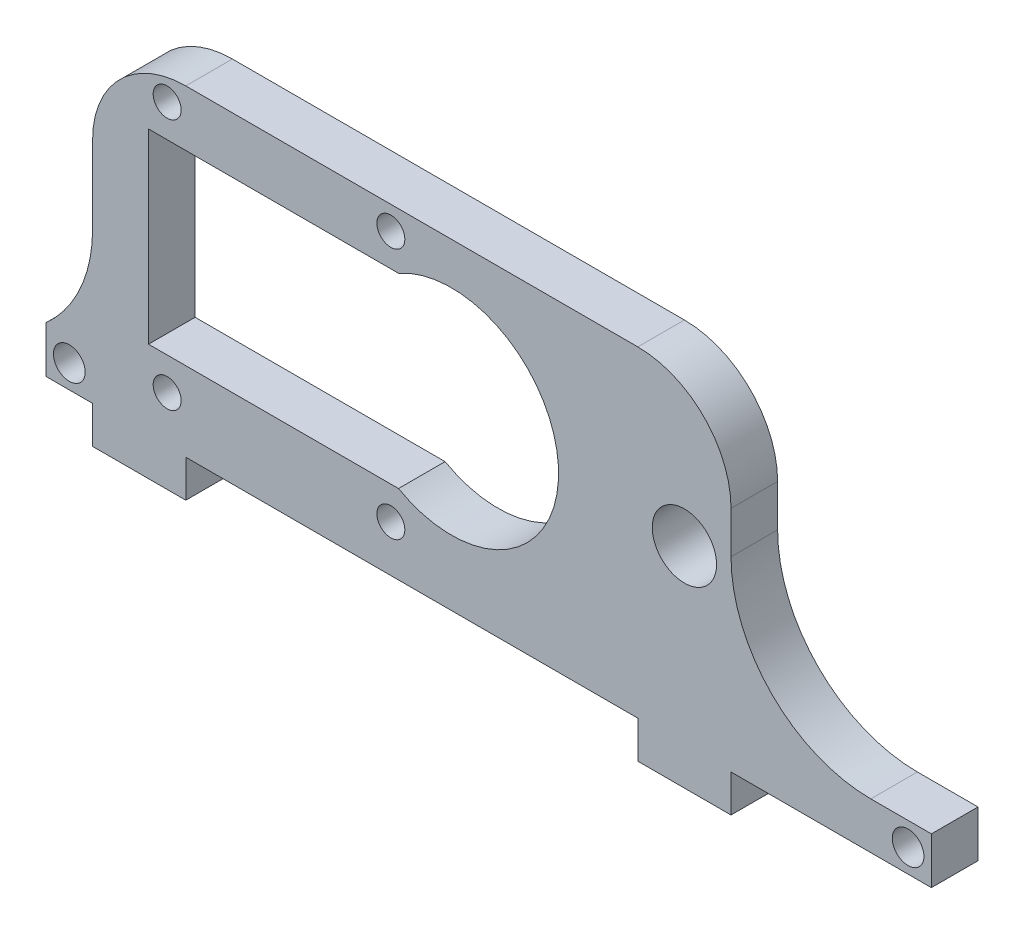
ISO-10303-21;
HEADER;
FILE_DESCRIPTION(('STEP AP214'),'2;1');
FILE_NAME('part.step','',(''),(''),'','','');
FILE_SCHEMA(('AUTOMOTIVE_DESIGN { 1 0 10303 214 1 1 1 1 }'));
ENDSEC;
DATA;
#1=APPLICATION_CONTEXT('core data for automotive mechanical design processes');
#2=APPLICATION_PROTOCOL_DEFINITION('international standard','automotive_design',2000,#1);
#3=PRODUCT_CONTEXT('',#1,'mechanical');
#4=PRODUCT('Part','Part','',(#3));
#5=PRODUCT_RELATED_PRODUCT_CATEGORY('part','',(#4));
#6=PRODUCT_DEFINITION_FORMATION('','',#4);
#7=PRODUCT_DEFINITION_CONTEXT('part definition',#1,'design');
#8=PRODUCT_DEFINITION('design','',#6,#7);
#9=PRODUCT_DEFINITION_SHAPE('','',#8);
#10=(LENGTH_UNIT() NAMED_UNIT(*) SI_UNIT(.MILLI.,.METRE.));
#11=(NAMED_UNIT(*) PLANE_ANGLE_UNIT() SI_UNIT($,.RADIAN.));
#12=(NAMED_UNIT(*) SI_UNIT($,.STERADIAN.) SOLID_ANGLE_UNIT());
#13=UNCERTAINTY_MEASURE_WITH_UNIT(LENGTH_MEASURE(1.E-05),#10,'distance_accuracy_value','');
#14=(GEOMETRIC_REPRESENTATION_CONTEXT(3) GLOBAL_UNCERTAINTY_ASSIGNED_CONTEXT((#13)) GLOBAL_UNIT_ASSIGNED_CONTEXT((#10,
#11,#12)) REPRESENTATION_CONTEXT('',''));
#15=CARTESIAN_POINT('',(0.,0.,0.));
#16=DIRECTION('',(0.,0.,1.));
#17=DIRECTION('',(1.,0.,0.));
#18=AXIS2_PLACEMENT_3D('',#15,#16,#17);
#19=CARTESIAN_POINT('',(51.5,-18.5,-5.));
#20=DIRECTION('',(1.,0.,0.));
#21=DIRECTION('',(0.,0.,-1.));
#22=AXIS2_PLACEMENT_3D('',#19,#20,#21);
#23=PLANE('',#22);
#24=DIRECTION('',(0.,1.,0.));
#25=VECTOR('',#24,1.);
#26=CARTESIAN_POINT('',(51.5,-18.5,0.));
#27=LINE('',#26,#25);
#28=CARTESIAN_POINT('',(51.5,-18.5,0.));
#29=VERTEX_POINT('',#28);
#30=CARTESIAN_POINT('',(51.5,-13.5,0.));
#31=VERTEX_POINT('',#30);
#32=EDGE_CURVE('E265',#29,#31,#27,.T.);
#33=ORIENTED_EDGE('',*,*,#32,.F.);
#34=DIRECTION('',(0.,0.,1.));
#35=VECTOR('',#34,1.);
#36=CARTESIAN_POINT('',(51.5,-18.5,-5.));
#37=LINE('',#36,#35);
#38=CARTESIAN_POINT('',(51.5,-18.5,-5.));
#39=VERTEX_POINT('',#38);
#40=EDGE_CURVE('E367',#39,#29,#37,.T.);
#41=ORIENTED_EDGE('',*,*,#40,.F.);
#42=DIRECTION('',(0.,1.,0.));
#43=VECTOR('',#42,1.);
#44=CARTESIAN_POINT('',(51.5,-18.5,-5.));
#45=LINE('',#44,#43);
#46=CARTESIAN_POINT('',(51.5,-13.5,-5.));
#47=VERTEX_POINT('',#46);
#48=EDGE_CURVE('E268',#39,#47,#45,.T.);
#49=ORIENTED_EDGE('',*,*,#48,.T.);
#50=DIRECTION('',(0.,0.,1.));
#51=VECTOR('',#50,1.);
#52=CARTESIAN_POINT('',(51.5,-13.5,-5.));
#53=LINE('',#52,#51);
#54=EDGE_CURVE('E318',#47,#31,#53,.T.);
#55=ORIENTED_EDGE('',*,*,#54,.T.);
#56=EDGE_LOOP('',(#33,#41,#49,#55));
#57=FACE_BOUND('',#56,.T.);
#58=ADVANCED_FACE('F35',(#57),#23,.T.);
#59=CARTESIAN_POINT('',(51.5,-18.5,-5.));
#60=DIRECTION('',(0.,-1.,0.));
#61=DIRECTION('',(0.,0.,-1.));
#62=AXIS2_PLACEMENT_3D('',#59,#60,#61);
#63=PLANE('',#62);
#64=DIRECTION('',(1.,0.,0.));
#65=VECTOR('',#64,1.);
#66=CARTESIAN_POINT('',(51.5,-18.5,0.));
#67=LINE('',#66,#65);
#68=CARTESIAN_POINT('',(30.,-18.5,0.));
#69=VERTEX_POINT('',#68);
#70=EDGE_CURVE('E272',#69,#29,#67,.T.);
#71=ORIENTED_EDGE('',*,*,#70,.F.);
#72=DIRECTION('',(0.,0.,1.));
#73=VECTOR('',#72,1.);
#74=CARTESIAN_POINT('',(30.,-18.5,-5.));
#75=LINE('',#74,#73);
#76=CARTESIAN_POINT('',(30.,-18.5,-5.));
#77=VERTEX_POINT('',#76);
#78=EDGE_CURVE('E370',#77,#69,#75,.T.);
#79=ORIENTED_EDGE('',*,*,#78,.F.);
#80=DIRECTION('',(1.,0.,0.));
#81=VECTOR('',#80,1.);
#82=CARTESIAN_POINT('',(51.5,-18.5,-5.));
#83=LINE('',#82,#81);
#84=EDGE_CURVE('E315',#77,#39,#83,.T.);
#85=ORIENTED_EDGE('',*,*,#84,.T.);
#86=ORIENTED_EDGE('',*,*,#40,.T.);
#87=EDGE_LOOP('',(#71,#79,#85,#86));
#88=FACE_BOUND('',#87,.T.);
#89=ADVANCED_FACE('F451',(#88),#63,.T.);
#90=CARTESIAN_POINT('',(30.,-18.5,-5.));
#91=DIRECTION('',(1.,0.,0.));
#92=DIRECTION('',(0.,0.,-1.));
#93=AXIS2_PLACEMENT_3D('',#90,#91,#92);
#94=PLANE('',#93);
#95=DIRECTION('',(0.,1.,0.));
#96=VECTOR('',#95,1.);
#97=CARTESIAN_POINT('',(30.,-18.5,0.));
#98=LINE('',#97,#96);
#99=CARTESIAN_POINT('',(30.,-22.5,0.));
#100=VERTEX_POINT('',#99);
#101=EDGE_CURVE('E362',#100,#69,#98,.T.);
#102=ORIENTED_EDGE('',*,*,#101,.F.);
#103=DIRECTION('',(0.,0.,1.));
#104=VECTOR('',#103,1.);
#105=CARTESIAN_POINT('',(30.,-22.5,-5.));
#106=LINE('',#105,#104);
#107=CARTESIAN_POINT('',(30.,-22.5,-5.));
#108=VERTEX_POINT('',#107);
#109=EDGE_CURVE('E372',#108,#100,#106,.T.);
#110=ORIENTED_EDGE('',*,*,#109,.F.);
#111=DIRECTION('',(0.,1.,0.));
#112=VECTOR('',#111,1.);
#113=CARTESIAN_POINT('',(30.,-18.5,-5.));
#114=LINE('',#113,#112);
#115=EDGE_CURVE('E312',#108,#77,#114,.T.);
#116=ORIENTED_EDGE('',*,*,#115,.T.);
#117=ORIENTED_EDGE('',*,*,#78,.T.);
#118=EDGE_LOOP('',(#102,#110,#116,#117));
#119=FACE_BOUND('',#118,.T.);
#120=ADVANCED_FACE('F454',(#119),#94,.T.);
#121=CARTESIAN_POINT('',(30.,-22.5,-5.));
#122=DIRECTION('',(0.,-1.,0.));
#123=DIRECTION('',(1.,0.,0.));
#124=AXIS2_PLACEMENT_3D('',#121,#122,#123);
#125=PLANE('',#124);
#126=DIRECTION('',(1.,0.,0.));
#127=VECTOR('',#126,1.);
#128=CARTESIAN_POINT('',(30.,-22.5,0.));
#129=LINE('',#128,#127);
#130=CARTESIAN_POINT('',(20.,-22.5,0.));
#131=VERTEX_POINT('',#130);
#132=EDGE_CURVE('E359',#131,#100,#129,.T.);
#133=ORIENTED_EDGE('',*,*,#132,.F.);
#134=DIRECTION('',(0.,0.,1.));
#135=VECTOR('',#134,1.);
#136=CARTESIAN_POINT('',(20.,-22.5,-5.));
#137=LINE('',#136,#135);
#138=CARTESIAN_POINT('',(20.,-22.5,-5.));
#139=VERTEX_POINT('',#138);
#140=EDGE_CURVE('E374',#139,#131,#137,.T.);
#141=ORIENTED_EDGE('',*,*,#140,.F.);
#142=DIRECTION('',(1.,0.,0.));
#143=VECTOR('',#142,1.);
#144=CARTESIAN_POINT('',(30.,-22.5,-5.));
#145=LINE('',#144,#143);
#146=EDGE_CURVE('E309',#139,#108,#145,.T.);
#147=ORIENTED_EDGE('',*,*,#146,.T.);
#148=ORIENTED_EDGE('',*,*,#109,.T.);
#149=EDGE_LOOP('',(#133,#141,#147,#148));
#150=FACE_BOUND('',#149,.T.);
#151=ADVANCED_FACE('F459',(#150),#125,.T.);
#152=CARTESIAN_POINT('',(20.,-18.5,-5.));
#153=DIRECTION('',(-1.,0.,0.));
#154=DIRECTION('',(0.,0.,1.));
#155=AXIS2_PLACEMENT_3D('',#152,#153,#154);
#156=PLANE('',#155);
#157=DIRECTION('',(0.,-1.,0.));
#158=VECTOR('',#157,1.);
#159=CARTESIAN_POINT('',(20.,-18.5,0.));
#160=LINE('',#159,#158);
#161=CARTESIAN_POINT('',(20.,-18.5,0.));
#162=VERTEX_POINT('',#161);
#163=EDGE_CURVE('E356',#162,#131,#160,.T.);
#164=ORIENTED_EDGE('',*,*,#163,.F.);
#165=DIRECTION('',(0.,0.,1.));
#166=VECTOR('',#165,1.);
#167=CARTESIAN_POINT('',(20.,-18.5,-5.));
#168=LINE('',#167,#166);
#169=CARTESIAN_POINT('',(20.,-18.5,-5.));
#170=VERTEX_POINT('',#169);
#171=EDGE_CURVE('E376',#170,#162,#168,.T.);
#172=ORIENTED_EDGE('',*,*,#171,.F.);
#173=DIRECTION('',(0.,-1.,0.));
#174=VECTOR('',#173,1.);
#175=CARTESIAN_POINT('',(20.,-18.5,-5.));
#176=LINE('',#175,#174);
#177=EDGE_CURVE('E306',#170,#139,#176,.T.);
#178=ORIENTED_EDGE('',*,*,#177,.T.);
#179=ORIENTED_EDGE('',*,*,#140,.T.);
#180=EDGE_LOOP('',(#164,#172,#178,#179));
#181=FACE_BOUND('',#180,.T.);
#182=ADVANCED_FACE('F462',(#181),#156,.T.);
#183=CARTESIAN_POINT('',(-28.5,-18.5,-5.));
#184=DIRECTION('',(0.,-1.,0.));
#185=DIRECTION('',(1.,0.,0.));
#186=AXIS2_PLACEMENT_3D('',#183,#184,#185);
#187=PLANE('',#186);
#188=DIRECTION('',(1.,0.,0.));
#189=VECTOR('',#188,1.);
#190=CARTESIAN_POINT('',(-28.5,-18.5,0.));
#191=LINE('',#190,#189);
#192=CARTESIAN_POINT('',(-28.5,-18.5,0.));
#193=VERTEX_POINT('',#192);
#194=EDGE_CURVE('E353',#193,#162,#191,.T.);
#195=ORIENTED_EDGE('',*,*,#194,.F.);
#196=DIRECTION('',(0.,0.,1.));
#197=VECTOR('',#196,1.);
#198=CARTESIAN_POINT('',(-28.5,-18.5,-5.));
#199=LINE('',#198,#197);
#200=CARTESIAN_POINT('',(-28.5,-18.5,-5.));
#201=VERTEX_POINT('',#200);
#202=EDGE_CURVE('E378',#201,#193,#199,.T.);
#203=ORIENTED_EDGE('',*,*,#202,.F.);
#204=DIRECTION('',(1.,0.,0.));
#205=VECTOR('',#204,1.);
#206=CARTESIAN_POINT('',(-28.5,-18.5,-5.));
#207=LINE('',#206,#205);
#208=EDGE_CURVE('E303',#201,#170,#207,.T.);
#209=ORIENTED_EDGE('',*,*,#208,.T.);
#210=ORIENTED_EDGE('',*,*,#171,.T.);
#211=EDGE_LOOP('',(#195,#203,#209,#210));
#212=FACE_BOUND('',#211,.T.);
#213=ADVANCED_FACE('F467',(#212),#187,.T.);
#214=CARTESIAN_POINT('',(-28.5,-18.5,-5.));
#215=DIRECTION('',(1.,0.,0.));
#216=DIRECTION('',(0.,0.,-1.));
#217=AXIS2_PLACEMENT_3D('',#214,#215,#216);
#218=PLANE('',#217);
#219=DIRECTION('',(0.,1.,0.));
#220=VECTOR('',#219,1.);
#221=CARTESIAN_POINT('',(-28.5,-18.5,0.));
#222=LINE('',#221,#220);
#223=CARTESIAN_POINT('',(-28.5,-22.5,0.));
#224=VERTEX_POINT('',#223);
#225=EDGE_CURVE('E350',#224,#193,#222,.T.);
#226=ORIENTED_EDGE('',*,*,#225,.F.);
#227=DIRECTION('',(0.,0.,1.));
#228=VECTOR('',#227,1.);
#229=CARTESIAN_POINT('',(-28.5,-22.5,-5.));
#230=LINE('',#229,#228);
#231=CARTESIAN_POINT('',(-28.5,-22.5,-5.));
#232=VERTEX_POINT('',#231);
#233=EDGE_CURVE('E380',#232,#224,#230,.T.);
#234=ORIENTED_EDGE('',*,*,#233,.F.);
#235=DIRECTION('',(0.,1.,0.));
#236=VECTOR('',#235,1.);
#237=CARTESIAN_POINT('',(-28.5,-18.5,-5.));
#238=LINE('',#237,#236);
#239=EDGE_CURVE('E300',#232,#201,#238,.T.);
#240=ORIENTED_EDGE('',*,*,#239,.T.);
#241=ORIENTED_EDGE('',*,*,#202,.T.);
#242=EDGE_LOOP('',(#226,#234,#240,#241));
#243=FACE_BOUND('',#242,.T.);
#244=ADVANCED_FACE('F470',(#243),#218,.T.);
#245=CARTESIAN_POINT('',(-38.5,-22.5,-5.));
#246=DIRECTION('',(0.,-1.,0.));
#247=DIRECTION('',(0.,0.,-1.));
#248=AXIS2_PLACEMENT_3D('',#245,#246,#247);
#249=PLANE('',#248);
#250=DIRECTION('',(1.,0.,0.));
#251=VECTOR('',#250,1.);
#252=CARTESIAN_POINT('',(-38.5,-22.5,0.));
#253=LINE('',#252,#251);
#254=CARTESIAN_POINT('',(-38.5,-22.5,0.));
#255=VERTEX_POINT('',#254);
#256=EDGE_CURVE('E347',#255,#224,#253,.T.);
#257=ORIENTED_EDGE('',*,*,#256,.F.);
#258=DIRECTION('',(0.,0.,1.));
#259=VECTOR('',#258,1.);
#260=CARTESIAN_POINT('',(-38.5,-22.5,-5.));
#261=LINE('',#260,#259);
#262=CARTESIAN_POINT('',(-38.5,-22.5,-5.));
#263=VERTEX_POINT('',#262);
#264=EDGE_CURVE('E382',#263,#255,#261,.T.);
#265=ORIENTED_EDGE('',*,*,#264,.F.);
#266=DIRECTION('',(1.,0.,0.));
#267=VECTOR('',#266,1.);
#268=CARTESIAN_POINT('',(-38.5,-22.5,-5.));
#269=LINE('',#268,#267);
#270=EDGE_CURVE('E297',#263,#232,#269,.T.);
#271=ORIENTED_EDGE('',*,*,#270,.T.);
#272=ORIENTED_EDGE('',*,*,#233,.T.);
#273=EDGE_LOOP('',(#257,#265,#271,#272));
#274=FACE_BOUND('',#273,.T.);
#275=ADVANCED_FACE('F475',(#274),#249,.T.);
#276=CARTESIAN_POINT('',(-38.5,-18.5,-5.));
#277=DIRECTION('',(-1.,0.,0.));
#278=DIRECTION('',(0.,0.,1.));
#279=AXIS2_PLACEMENT_3D('',#276,#277,#278);
#280=PLANE('',#279);
#281=DIRECTION('',(0.,-1.,0.));
#282=VECTOR('',#281,1.);
#283=CARTESIAN_POINT('',(-38.5,-18.5,0.));
#284=LINE('',#283,#282);
#285=CARTESIAN_POINT('',(-38.5,-18.5,0.));
#286=VERTEX_POINT('',#285);
#287=EDGE_CURVE('E344',#286,#255,#284,.T.);
#288=ORIENTED_EDGE('',*,*,#287,.F.);
#289=DIRECTION('',(0.,0.,1.));
#290=VECTOR('',#289,1.);
#291=CARTESIAN_POINT('',(-38.5,-18.5,-5.));
#292=LINE('',#291,#290);
#293=CARTESIAN_POINT('',(-38.5,-18.5,-5.));
#294=VERTEX_POINT('',#293);
#295=EDGE_CURVE('E384',#294,#286,#292,.T.);
#296=ORIENTED_EDGE('',*,*,#295,.F.);
#297=DIRECTION('',(0.,-1.,0.));
#298=VECTOR('',#297,1.);
#299=CARTESIAN_POINT('',(-38.5,-18.5,-5.));
#300=LINE('',#299,#298);
#301=EDGE_CURVE('E294',#294,#263,#300,.T.);
#302=ORIENTED_EDGE('',*,*,#301,.T.);
#303=ORIENTED_EDGE('',*,*,#264,.T.);
#304=EDGE_LOOP('',(#288,#296,#302,#303));
#305=FACE_BOUND('',#304,.T.);
#306=ADVANCED_FACE('F478',(#305),#280,.T.);
#307=CARTESIAN_POINT('',(-38.5,-18.5,-5.));
#308=DIRECTION('',(0.,-1.,0.));
#309=DIRECTION('',(0.,0.,-1.));
#310=AXIS2_PLACEMENT_3D('',#307,#308,#309);
#311=PLANE('',#310);
#312=DIRECTION('',(1.,0.,0.));
#313=VECTOR('',#312,1.);
#314=CARTESIAN_POINT('',(-38.5,-18.5,0.));
#315=LINE('',#314,#313);
#316=CARTESIAN_POINT('',(-43.5,-18.5,0.));
#317=VERTEX_POINT('',#316);
#318=EDGE_CURVE('E341',#317,#286,#315,.T.);
#319=ORIENTED_EDGE('',*,*,#318,.F.);
#320=DIRECTION('',(0.,0.,1.));
#321=VECTOR('',#320,1.);
#322=CARTESIAN_POINT('',(-43.5,-18.5,-5.));
#323=LINE('',#322,#321);
#324=CARTESIAN_POINT('',(-43.5,-18.5,-5.));
#325=VERTEX_POINT('',#324);
#326=EDGE_CURVE('E386',#325,#317,#323,.T.);
#327=ORIENTED_EDGE('',*,*,#326,.F.);
#328=DIRECTION('',(1.,0.,0.));
#329=VECTOR('',#328,1.);
#330=CARTESIAN_POINT('',(-38.5,-18.5,-5.));
#331=LINE('',#330,#329);
#332=EDGE_CURVE('E291',#325,#294,#331,.T.);
#333=ORIENTED_EDGE('',*,*,#332,.T.);
#334=ORIENTED_EDGE('',*,*,#295,.T.);
#335=EDGE_LOOP('',(#319,#327,#333,#334));
#336=FACE_BOUND('',#335,.T.);
#337=ADVANCED_FACE('F481',(#336),#311,.T.);
#338=CARTESIAN_POINT('',(-43.5,-18.5,-5.));
#339=DIRECTION('',(-1.,0.,0.));
#340=DIRECTION('',(0.,0.,1.));
#341=AXIS2_PLACEMENT_3D('',#338,#339,#340);
#342=PLANE('',#341);
#343=DIRECTION('',(0.,-1.,0.));
#344=VECTOR('',#343,1.);
#345=CARTESIAN_POINT('',(-43.5,-18.5,0.));
#346=LINE('',#345,#344);
#347=CARTESIAN_POINT('',(-43.5,-13.5,0.));
#348=VERTEX_POINT('',#347);
#349=EDGE_CURVE('E338',#348,#317,#346,.T.);
#350=ORIENTED_EDGE('',*,*,#349,.F.);
#351=DIRECTION('',(0.,0.,1.));
#352=VECTOR('',#351,1.);
#353=CARTESIAN_POINT('',(-43.5,-13.5,-5.));
#354=LINE('',#353,#352);
#355=CARTESIAN_POINT('',(-43.5,-13.5,-5.));
#356=VERTEX_POINT('',#355);
#357=EDGE_CURVE('E388',#356,#348,#354,.T.);
#358=ORIENTED_EDGE('',*,*,#357,.F.);
#359=DIRECTION('',(0.,-1.,0.));
#360=VECTOR('',#359,1.);
#361=CARTESIAN_POINT('',(-43.5,-18.5,-5.));
#362=LINE('',#361,#360);
#363=EDGE_CURVE('E288',#356,#325,#362,.T.);
#364=ORIENTED_EDGE('',*,*,#363,.T.);
#365=ORIENTED_EDGE('',*,*,#326,.T.);
#366=EDGE_LOOP('',(#350,#358,#364,#365));
#367=FACE_BOUND('',#366,.T.);
#368=ADVANCED_FACE('F414',(#367),#342,.T.);
#369=CARTESIAN_POINT('',(-38.5,5.99999999999993,-5.));
#370=DIRECTION('',(-1.,0.,0.));
#371=DIRECTION('',(0.,-1.,0.));
#372=AXIS2_PLACEMENT_3D('',#369,#370,#371);
#373=PLANE('',#372);
#374=DIRECTION('',(0.,-1.,0.));
#375=VECTOR('',#374,1.);
#376=CARTESIAN_POINT('',(-38.5,5.99999999999993,-5.));
#377=LINE('',#376,#375);
#378=CARTESIAN_POINT('',(-38.5,5.99999999999993,-5.));
#379=VERTEX_POINT('',#378);
#380=CARTESIAN_POINT('',(-38.5,-2.31966011250104,-5.));
#381=VERTEX_POINT('',#380);
#382=EDGE_CURVE('E286',#379,#381,#377,.T.);
#383=ORIENTED_EDGE('',*,*,#382,.T.);
#384=DIRECTION('',(0.,0.,-1.));
#385=VECTOR('',#384,1.);
#386=CARTESIAN_POINT('',(-38.5,-2.31966011250104,0.));
#387=LINE('',#386,#385);
#388=CARTESIAN_POINT('',(-38.5,-2.31966011250104,0.));
#389=VERTEX_POINT('',#388);
#390=EDGE_CURVE('E408',#381,#389,#387,.F.);
#391=ORIENTED_EDGE('',*,*,#390,.T.);
#392=DIRECTION('',(0.,-1.,0.));
#393=VECTOR('',#392,1.);
#394=CARTESIAN_POINT('',(-38.5,5.99999999999993,0.));
#395=LINE('',#394,#393);
#396=CARTESIAN_POINT('',(-38.5,5.99999999999993,0.));
#397=VERTEX_POINT('',#396);
#398=EDGE_CURVE('E335',#397,#389,#395,.T.);
#399=ORIENTED_EDGE('',*,*,#398,.F.);
#400=DIRECTION('',(0.,0.,1.));
#401=VECTOR('',#400,1.);
#402=CARTESIAN_POINT('',(-38.5,5.99999999999993,-5.));
#403=LINE('',#402,#401);
#404=EDGE_CURVE('E390',#379,#397,#403,.T.);
#405=ORIENTED_EDGE('',*,*,#404,.F.);
#406=EDGE_LOOP('',(#383,#391,#399,#405));
#407=FACE_BOUND('',#406,.T.);
#408=ADVANCED_FACE('F417',(#407),#373,.T.);
#409=CARTESIAN_POINT('',(-28.5,6.,-5.));
#410=DIRECTION('',(0.,0.,1.));
#411=DIRECTION('',(1.,0.,0.));
#412=AXIS2_PLACEMENT_3D('',#409,#410,#411);
#413=CYLINDRICAL_SURFACE('',#412,10.);
#414=CARTESIAN_POINT('',(-28.5,6.,0.));
#415=DIRECTION('',(0.,0.,1.));
#416=DIRECTION('',(1.,0.,0.));
#417=AXIS2_PLACEMENT_3D('',#414,#415,#416);
#418=CIRCLE('',#417,10.);
#419=CARTESIAN_POINT('',(-28.4999999999999,16.,0.));
#420=VERTEX_POINT('',#419);
#421=EDGE_CURVE('E332',#420,#397,#418,.T.);
#422=ORIENTED_EDGE('',*,*,#421,.F.);
#423=DIRECTION('',(0.,0.,1.));
#424=VECTOR('',#423,1.);
#425=CARTESIAN_POINT('',(-28.4999999999999,16.,-5.));
#426=LINE('',#425,#424);
#427=CARTESIAN_POINT('',(-28.4999999999999,16.,-5.));
#428=VERTEX_POINT('',#427);
#429=EDGE_CURVE('E392',#428,#420,#426,.T.);
#430=ORIENTED_EDGE('',*,*,#429,.F.);
#431=CARTESIAN_POINT('',(-28.5,6.,-5.));
#432=DIRECTION('',(0.,0.,1.));
#433=DIRECTION('',(1.,0.,0.));
#434=AXIS2_PLACEMENT_3D('',#431,#432,#433);
#435=CIRCLE('',#434,10.);
#436=EDGE_CURVE('E283',#428,#379,#435,.T.);
#437=ORIENTED_EDGE('',*,*,#436,.T.);
#438=ORIENTED_EDGE('',*,*,#404,.T.);
#439=EDGE_LOOP('',(#422,#430,#437,#438));
#440=FACE_BOUND('',#439,.T.);
#441=ADVANCED_FACE('F423',(#440),#413,.T.);
#442=CARTESIAN_POINT('',(-28.4999999999999,16.,-5.));
#443=DIRECTION('',(0.,1.,0.));
#444=DIRECTION('',(0.,0.,1.));
#445=AXIS2_PLACEMENT_3D('',#442,#443,#444);
#446=PLANE('',#445);
#447=DIRECTION('',(-1.,0.,0.));
#448=VECTOR('',#447,1.);
#449=CARTESIAN_POINT('',(-28.4999999999999,16.,0.));
#450=LINE('',#449,#448);
#451=CARTESIAN_POINT('',(20.,16.,0.));
#452=VERTEX_POINT('',#451);
#453=EDGE_CURVE('E329',#452,#420,#450,.T.);
#454=ORIENTED_EDGE('',*,*,#453,.F.);
#455=DIRECTION('',(0.,0.,1.));
#456=VECTOR('',#455,1.);
#457=CARTESIAN_POINT('',(20.,16.,-5.));
#458=LINE('',#457,#456);
#459=CARTESIAN_POINT('',(20.,16.,-5.));
#460=VERTEX_POINT('',#459);
#461=EDGE_CURVE('E394',#460,#452,#458,.T.);
#462=ORIENTED_EDGE('',*,*,#461,.F.);
#463=DIRECTION('',(-1.,0.,0.));
#464=VECTOR('',#463,1.);
#465=CARTESIAN_POINT('',(-28.4999999999999,16.,-5.));
#466=LINE('',#465,#464);
#467=EDGE_CURVE('E280',#460,#428,#466,.T.);
#468=ORIENTED_EDGE('',*,*,#467,.T.);
#469=ORIENTED_EDGE('',*,*,#429,.T.);
#470=EDGE_LOOP('',(#454,#462,#468,#469));
#471=FACE_BOUND('',#470,.T.);
#472=ADVANCED_FACE('F426',(#471),#446,.T.);
#473=CARTESIAN_POINT('',(20.,6.,-5.));
#474=DIRECTION('',(0.,0.,1.));
#475=DIRECTION('',(1.,0.,0.));
#476=AXIS2_PLACEMENT_3D('',#473,#474,#475);
#477=CYLINDRICAL_SURFACE('',#476,10.);
#478=CARTESIAN_POINT('',(20.,6.,0.));
#479=DIRECTION('',(0.,0.,1.));
#480=DIRECTION('',(-1.,0.,0.));
#481=AXIS2_PLACEMENT_3D('',#478,#479,#480);
#482=CIRCLE('',#481,10.);
#483=CARTESIAN_POINT('',(30.,6.,0.));
#484=VERTEX_POINT('',#483);
#485=EDGE_CURVE('E326',#484,#452,#482,.T.);
#486=ORIENTED_EDGE('',*,*,#485,.F.);
#487=DIRECTION('',(0.,0.,1.));
#488=VECTOR('',#487,1.);
#489=CARTESIAN_POINT('',(30.,6.,-5.));
#490=LINE('',#489,#488);
#491=CARTESIAN_POINT('',(30.,6.,-5.));
#492=VERTEX_POINT('',#491);
#493=EDGE_CURVE('E396',#492,#484,#490,.T.);
#494=ORIENTED_EDGE('',*,*,#493,.F.);
#495=CARTESIAN_POINT('',(20.,6.,-5.));
#496=DIRECTION('',(0.,0.,1.));
#497=DIRECTION('',(-1.,0.,0.));
#498=AXIS2_PLACEMENT_3D('',#495,#496,#497);
#499=CIRCLE('',#498,10.);
#500=EDGE_CURVE('E277',#492,#460,#499,.T.);
#501=ORIENTED_EDGE('',*,*,#500,.T.);
#502=ORIENTED_EDGE('',*,*,#461,.T.);
#503=EDGE_LOOP('',(#486,#494,#501,#502));
#504=FACE_BOUND('',#503,.T.);
#505=ADVANCED_FACE('F432',(#504),#477,.T.);
#506=CARTESIAN_POINT('',(30.,6.,-5.));
#507=DIRECTION('',(1.,0.,0.));
#508=DIRECTION('',(0.,0.,-1.));
#509=AXIS2_PLACEMENT_3D('',#506,#507,#508);
#510=PLANE('',#509);
#511=DIRECTION('',(0.,1.,0.));
#512=VECTOR('',#511,1.);
#513=CARTESIAN_POINT('',(30.,6.,0.));
#514=LINE('',#513,#512);
#515=CARTESIAN_POINT('',(30.,1.50000000000001,0.));
#516=VERTEX_POINT('',#515);
#517=EDGE_CURVE('E324',#516,#484,#514,.T.);
#518=ORIENTED_EDGE('',*,*,#517,.F.);
#519=DIRECTION('',(0.,0.,1.));
#520=VECTOR('',#519,1.);
#521=CARTESIAN_POINT('',(30.,1.50000000000001,-5.));
#522=LINE('',#521,#520);
#523=CARTESIAN_POINT('',(30.,1.50000000000001,-5.));
#524=VERTEX_POINT('',#523);
#525=EDGE_CURVE('E402',#516,#524,#522,.F.);
#526=ORIENTED_EDGE('',*,*,#525,.T.);
#527=DIRECTION('',(0.,1.,0.));
#528=VECTOR('',#527,1.);
#529=CARTESIAN_POINT('',(30.,6.,-5.));
#530=LINE('',#529,#528);
#531=EDGE_CURVE('E275',#524,#492,#530,.T.);
#532=ORIENTED_EDGE('',*,*,#531,.T.);
#533=ORIENTED_EDGE('',*,*,#493,.T.);
#534=EDGE_LOOP('',(#518,#526,#532,#533));
#535=FACE_BOUND('',#534,.T.);
#536=ADVANCED_FACE('F435',(#535),#510,.T.);
#537=CARTESIAN_POINT('',(51.5,-13.5,-5.));
#538=DIRECTION('',(0.,1.,0.));
#539=DIRECTION('',(-1.,0.,0.));
#540=AXIS2_PLACEMENT_3D('',#537,#538,#539);
#541=PLANE('',#540);
#542=DIRECTION('',(-1.,0.,0.));
#543=VECTOR('',#542,1.);
#544=CARTESIAN_POINT('',(51.5,-13.5,-5.));
#545=LINE('',#544,#543);
#546=CARTESIAN_POINT('',(45.,-13.5,-5.));
#547=VERTEX_POINT('',#546);
#548=EDGE_CURVE('E271',#47,#547,#545,.T.);
#549=ORIENTED_EDGE('',*,*,#548,.T.);
#550=DIRECTION('',(0.,0.,1.));
#551=VECTOR('',#550,1.);
#552=CARTESIAN_POINT('',(45.,-13.5,0.));
#553=LINE('',#552,#551);
#554=CARTESIAN_POINT('',(45.,-13.5,0.));
#555=VERTEX_POINT('',#554);
#556=EDGE_CURVE('E369',#547,#555,#553,.T.);
#557=ORIENTED_EDGE('',*,*,#556,.T.);
#558=DIRECTION('',(-1.,0.,0.));
#559=VECTOR('',#558,1.);
#560=CARTESIAN_POINT('',(51.5,-13.5,0.));
#561=LINE('',#560,#559);
#562=EDGE_CURVE('E321',#31,#555,#561,.T.);
#563=ORIENTED_EDGE('',*,*,#562,.F.);
#564=ORIENTED_EDGE('',*,*,#54,.F.);
#565=EDGE_LOOP('',(#549,#557,#563,#564));
#566=FACE_BOUND('',#565,.T.);
#567=ADVANCED_FACE('F444',(#566),#541,.T.);
#568=CARTESIAN_POINT('',(20.,6.,-5.));
#569=DIRECTION('',(0.,0.,-1.));
#570=DIRECTION('',(-1.,0.,0.));
#571=AXIS2_PLACEMENT_3D('',#568,#569,#570);
#572=PLANE('',#571);
#573=CARTESIAN_POINT('',(49.,-16.,-5.));
#574=DIRECTION('',(0.,0.,1.));
#575=DIRECTION('',(1.,0.,0.));
#576=AXIS2_PLACEMENT_3D('',#573,#574,#575);
#577=CIRCLE('',#576,1.7);
#578=CARTESIAN_POINT('',(50.7,-16.,-5.));
#579=VERTEX_POINT('',#578);
#580=EDGE_CURVE('E843',#579,#579,#577,.T.);
#581=ORIENTED_EDGE('',*,*,#580,.T.);
#582=EDGE_LOOP('',(#581));
#583=FACE_BOUND('',#582,.T.);
#584=CARTESIAN_POINT('',(-41.,-16.,-5.));
#585=DIRECTION('',(0.,0.,1.));
#586=DIRECTION('',(1.,0.,0.));
#587=AXIS2_PLACEMENT_3D('',#584,#585,#586);
#588=CIRCLE('',#587,1.7);
#589=CARTESIAN_POINT('',(-39.3,-16.,-5.));
#590=VERTEX_POINT('',#589);
#591=EDGE_CURVE('E228',#590,#590,#588,.T.);
#592=ORIENTED_EDGE('',*,*,#591,.T.);
#593=EDGE_LOOP('',(#592));
#594=FACE_BOUND('',#593,.T.);
#595=CARTESIAN_POINT('',(0.,0.,-5.));
#596=DIRECTION('',(0.,0.,1.));
#597=DIRECTION('',(1.,0.,0.));
#598=AXIS2_PLACEMENT_3D('',#595,#596,#597);
#599=CIRCLE('',#598,11.5);
#600=CARTESIAN_POINT('',(-5.67890834580027,-10.,-5.));
#601=VERTEX_POINT('',#600);
#602=CARTESIAN_POINT('',(-5.67890834580027,10.,-5.));
#603=VERTEX_POINT('',#602);
#604=EDGE_CURVE('E194',#601,#603,#599,.T.);
#605=ORIENTED_EDGE('',*,*,#604,.T.);
#606=DIRECTION('',(-1.,0.,0.));
#607=VECTOR('',#606,1.);
#608=CARTESIAN_POINT('',(-5.67890834580027,10.,-5.));
#609=LINE('',#608,#607);
#610=CARTESIAN_POINT('',(-32.5,9.99999999999999,-5.));
#611=VERTEX_POINT('',#610);
#612=EDGE_CURVE('E206',#603,#611,#609,.T.);
#613=ORIENTED_EDGE('',*,*,#612,.T.);
#614=DIRECTION('',(0.,-1.,0.));
#615=VECTOR('',#614,1.);
#616=CARTESIAN_POINT('',(-32.5,9.99999999999999,-5.));
#617=LINE('',#616,#615);
#618=CARTESIAN_POINT('',(-32.5,-9.99999999999999,-5.));
#619=VERTEX_POINT('',#618);
#620=EDGE_CURVE('E210',#611,#619,#617,.T.);
#621=ORIENTED_EDGE('',*,*,#620,.T.);
#622=DIRECTION('',(1.,0.,0.));
#623=VECTOR('',#622,1.);
#624=CARTESIAN_POINT('',(-5.67890834580027,-10.,-5.));
#625=LINE('',#624,#623);
#626=EDGE_CURVE('E202',#619,#601,#625,.T.);
#627=ORIENTED_EDGE('',*,*,#626,.T.);
#628=EDGE_LOOP('',(#605,#613,#621,#627));
#629=FACE_BOUND('',#628,.T.);
#630=CARTESIAN_POINT('',(-6.5,-13.5,-5.));
#631=DIRECTION('',(0.,0.,1.));
#632=DIRECTION('',(1.,0.,0.));
#633=AXIS2_PLACEMENT_3D('',#630,#631,#632);
#634=CIRCLE('',#633,1.5);
#635=CARTESIAN_POINT('',(-5.,-13.5,-5.));
#636=VERTEX_POINT('',#635);
#637=EDGE_CURVE('E238',#636,#636,#634,.T.);
#638=ORIENTED_EDGE('',*,*,#637,.T.);
#639=EDGE_LOOP('',(#638));
#640=FACE_BOUND('',#639,.T.);
#641=CARTESIAN_POINT('',(-30.5,-13.5,-5.));
#642=DIRECTION('',(0.,0.,1.));
#643=DIRECTION('',(1.,0.,0.));
#644=AXIS2_PLACEMENT_3D('',#641,#642,#643);
#645=CIRCLE('',#644,1.5);
#646=CARTESIAN_POINT('',(-29.,-13.5,-5.));
#647=VERTEX_POINT('',#646);
#648=EDGE_CURVE('E244',#647,#647,#645,.T.);
#649=ORIENTED_EDGE('',*,*,#648,.T.);
#650=EDGE_LOOP('',(#649));
#651=FACE_BOUND('',#650,.T.);
#652=CARTESIAN_POINT('',(-30.5,13.5,-5.));
#653=DIRECTION('',(0.,0.,1.));
#654=DIRECTION('',(1.,0.,0.));
#655=AXIS2_PLACEMENT_3D('',#652,#653,#654);
#656=CIRCLE('',#655,1.5);
#657=CARTESIAN_POINT('',(-29.,13.5,-5.));
#658=VERTEX_POINT('',#657);
#659=EDGE_CURVE('E250',#658,#658,#656,.T.);
#660=ORIENTED_EDGE('',*,*,#659,.T.);
#661=EDGE_LOOP('',(#660));
#662=FACE_BOUND('',#661,.T.);
#663=CARTESIAN_POINT('',(-6.5,13.5,-5.));
#664=DIRECTION('',(0.,0.,1.));
#665=DIRECTION('',(1.,0.,0.));
#666=AXIS2_PLACEMENT_3D('',#663,#664,#665);
#667=CIRCLE('',#666,1.5);
#668=CARTESIAN_POINT('',(-5.,13.5,-5.));
#669=VERTEX_POINT('',#668);
#670=EDGE_CURVE('E256',#669,#669,#667,.T.);
#671=ORIENTED_EDGE('',*,*,#670,.T.);
#672=EDGE_LOOP('',(#671));
#673=FACE_BOUND('',#672,.T.);
#674=CARTESIAN_POINT('',(25.,0.,-5.));
#675=DIRECTION('',(0.,0.,1.));
#676=DIRECTION('',(1.,0.,0.));
#677=AXIS2_PLACEMENT_3D('',#674,#675,#676);
#678=CIRCLE('',#677,3.45);
#679=CARTESIAN_POINT('',(28.45,0.,-5.));
#680=VERTEX_POINT('',#679);
#681=EDGE_CURVE('E262',#680,#680,#678,.T.);
#682=ORIENTED_EDGE('',*,*,#681,.T.);
#683=EDGE_LOOP('',(#682));
#684=FACE_BOUND('',#683,.T.);
#685=ORIENTED_EDGE('',*,*,#48,.F.);
#686=ORIENTED_EDGE('',*,*,#84,.F.);
#687=ORIENTED_EDGE('',*,*,#115,.F.);
#688=ORIENTED_EDGE('',*,*,#146,.F.);
#689=ORIENTED_EDGE('',*,*,#177,.F.);
#690=ORIENTED_EDGE('',*,*,#208,.F.);
#691=ORIENTED_EDGE('',*,*,#239,.F.);
#692=ORIENTED_EDGE('',*,*,#270,.F.);
#693=ORIENTED_EDGE('',*,*,#301,.F.);
#694=ORIENTED_EDGE('',*,*,#332,.F.);
#695=ORIENTED_EDGE('',*,*,#363,.F.);
#696=CARTESIAN_POINT('',(-53.5,-2.31966011250105,-5.));
#697=DIRECTION('',(0.,0.,-1.));
#698=DIRECTION('',(-1.,0.,0.));
#699=AXIS2_PLACEMENT_3D('',#696,#697,#698);
#700=CIRCLE('',#699,15.);
#701=EDGE_CURVE('E11',#356,#381,#700,.F.);
#702=ORIENTED_EDGE('',*,*,#701,.T.);
#703=ORIENTED_EDGE('',*,*,#382,.F.);
#704=ORIENTED_EDGE('',*,*,#436,.F.);
#705=ORIENTED_EDGE('',*,*,#467,.F.);
#706=ORIENTED_EDGE('',*,*,#500,.F.);
#707=ORIENTED_EDGE('',*,*,#531,.F.);
#708=CARTESIAN_POINT('',(45.,1.50000000000001,-5.));
#709=DIRECTION('',(0.,0.,-1.));
#710=DIRECTION('',(-1.,0.,0.));
#711=AXIS2_PLACEMENT_3D('',#708,#709,#710);
#712=CIRCLE('',#711,15.);
#713=EDGE_CURVE('E406',#524,#547,#712,.F.);
#714=ORIENTED_EDGE('',*,*,#713,.T.);
#715=ORIENTED_EDGE('',*,*,#548,.F.);
#716=EDGE_LOOP('',(#685,#686,#687,#688,#689,#690,#691,#692,#693,#694,#695,#702,#703,#704,#705,
#706,#707,#714,#715));
#717=FACE_BOUND('',#716,.T.);
#718=ADVANCED_FACE('F212',(#583,#594,#629,#640,#651,#662,#673,#684,#717),#572,.T.);
#719=CARTESIAN_POINT('',(20.,6.,0.));
#720=DIRECTION('',(0.,0.,-1.));
#721=DIRECTION('',(-1.,0.,0.));
#722=AXIS2_PLACEMENT_3D('',#719,#720,#721);
#723=PLANE('',#722);
#724=CARTESIAN_POINT('',(49.,-16.,0.));
#725=DIRECTION('',(0.,0.,1.));
#726=DIRECTION('',(1.,0.,0.));
#727=AXIS2_PLACEMENT_3D('',#724,#725,#726);
#728=CIRCLE('',#727,1.7);
#729=CARTESIAN_POINT('',(50.7,-16.,0.));
#730=VERTEX_POINT('',#729);
#731=EDGE_CURVE('E821',#730,#730,#728,.T.);
#732=ORIENTED_EDGE('',*,*,#731,.F.);
#733=EDGE_LOOP('',(#732));
#734=FACE_BOUND('',#733,.T.);
#735=CARTESIAN_POINT('',(-41.,-16.,0.));
#736=DIRECTION('',(0.,0.,1.));
#737=DIRECTION('',(1.,0.,0.));
#738=AXIS2_PLACEMENT_3D('',#735,#736,#737);
#739=CIRCLE('',#738,1.7);
#740=CARTESIAN_POINT('',(-39.3,-16.,0.));
#741=VERTEX_POINT('',#740);
#742=EDGE_CURVE('E221',#741,#741,#739,.T.);
#743=ORIENTED_EDGE('',*,*,#742,.F.);
#744=EDGE_LOOP('',(#743));
#745=FACE_BOUND('',#744,.T.);
#746=DIRECTION('',(-1.,0.,0.));
#747=VECTOR('',#746,1.);
#748=CARTESIAN_POINT('',(-5.67890834580027,10.,0.));
#749=LINE('',#748,#747);
#750=CARTESIAN_POINT('',(-5.67890834580027,10.,0.));
#751=VERTEX_POINT('',#750);
#752=CARTESIAN_POINT('',(-32.5,9.99999999999999,0.));
#753=VERTEX_POINT('',#752);
#754=EDGE_CURVE('E227',#751,#753,#749,.T.);
#755=ORIENTED_EDGE('',*,*,#754,.F.);
#756=CARTESIAN_POINT('',(0.,0.,0.));
#757=DIRECTION('',(0.,0.,1.));
#758=DIRECTION('',(1.,0.,0.));
#759=AXIS2_PLACEMENT_3D('',#756,#757,#758);
#760=CIRCLE('',#759,11.5);
#761=CARTESIAN_POINT('',(-5.67890834580027,-10.,0.));
#762=VERTEX_POINT('',#761);
#763=EDGE_CURVE('E197',#762,#751,#760,.T.);
#764=ORIENTED_EDGE('',*,*,#763,.F.);
#765=DIRECTION('',(1.,0.,0.));
#766=VECTOR('',#765,1.);
#767=CARTESIAN_POINT('',(-5.67890834580027,-10.,0.));
#768=LINE('',#767,#766);
#769=CARTESIAN_POINT('',(-32.5,-9.99999999999999,0.));
#770=VERTEX_POINT('',#769);
#771=EDGE_CURVE('E215',#770,#762,#768,.T.);
#772=ORIENTED_EDGE('',*,*,#771,.F.);
#773=DIRECTION('',(0.,-1.,0.));
#774=VECTOR('',#773,1.);
#775=CARTESIAN_POINT('',(-32.5,9.99999999999999,0.));
#776=LINE('',#775,#774);
#777=EDGE_CURVE('E218',#753,#770,#776,.T.);
#778=ORIENTED_EDGE('',*,*,#777,.F.);
#779=EDGE_LOOP('',(#755,#764,#772,#778));
#780=FACE_BOUND('',#779,.T.);
#781=CARTESIAN_POINT('',(-6.5,-13.5,0.));
#782=DIRECTION('',(0.,0.,1.));
#783=DIRECTION('',(1.,0.,0.));
#784=AXIS2_PLACEMENT_3D('',#781,#782,#783);
#785=CIRCLE('',#784,1.5);
#786=CARTESIAN_POINT('',(-5.,-13.5,0.));
#787=VERTEX_POINT('',#786);
#788=EDGE_CURVE('E234',#787,#787,#785,.T.);
#789=ORIENTED_EDGE('',*,*,#788,.F.);
#790=EDGE_LOOP('',(#789));
#791=FACE_BOUND('',#790,.T.);
#792=CARTESIAN_POINT('',(-30.5,-13.5,0.));
#793=DIRECTION('',(0.,0.,1.));
#794=DIRECTION('',(1.,0.,0.));
#795=AXIS2_PLACEMENT_3D('',#792,#793,#794);
#796=CIRCLE('',#795,1.5);
#797=CARTESIAN_POINT('',(-29.,-13.5,0.));
#798=VERTEX_POINT('',#797);
#799=EDGE_CURVE('E241',#798,#798,#796,.T.);
#800=ORIENTED_EDGE('',*,*,#799,.F.);
#801=EDGE_LOOP('',(#800));
#802=FACE_BOUND('',#801,.T.);
#803=CARTESIAN_POINT('',(-30.5,13.5,0.));
#804=DIRECTION('',(0.,0.,1.));
#805=DIRECTION('',(1.,0.,0.));
#806=AXIS2_PLACEMENT_3D('',#803,#804,#805);
#807=CIRCLE('',#806,1.5);
#808=CARTESIAN_POINT('',(-29.,13.5,0.));
#809=VERTEX_POINT('',#808);
#810=EDGE_CURVE('E247',#809,#809,#807,.T.);
#811=ORIENTED_EDGE('',*,*,#810,.F.);
#812=EDGE_LOOP('',(#811));
#813=FACE_BOUND('',#812,.T.);
#814=CARTESIAN_POINT('',(-6.5,13.5,0.));
#815=DIRECTION('',(0.,0.,1.));
#816=DIRECTION('',(1.,0.,0.));
#817=AXIS2_PLACEMENT_3D('',#814,#815,#816);
#818=CIRCLE('',#817,1.5);
#819=CARTESIAN_POINT('',(-5.,13.5,0.));
#820=VERTEX_POINT('',#819);
#821=EDGE_CURVE('E253',#820,#820,#818,.T.);
#822=ORIENTED_EDGE('',*,*,#821,.F.);
#823=EDGE_LOOP('',(#822));
#824=FACE_BOUND('',#823,.T.);
#825=CARTESIAN_POINT('',(25.,0.,0.));
#826=DIRECTION('',(0.,0.,1.));
#827=DIRECTION('',(1.,0.,0.));
#828=AXIS2_PLACEMENT_3D('',#825,#826,#827);
#829=CIRCLE('',#828,3.45);
#830=CARTESIAN_POINT('',(28.45,0.,0.));
#831=VERTEX_POINT('',#830);
#832=EDGE_CURVE('E259',#831,#831,#829,.T.);
#833=ORIENTED_EDGE('',*,*,#832,.F.);
#834=EDGE_LOOP('',(#833));
#835=FACE_BOUND('',#834,.T.);
#836=ORIENTED_EDGE('',*,*,#32,.T.);
#837=ORIENTED_EDGE('',*,*,#562,.T.);
#838=CARTESIAN_POINT('',(45.,1.50000000000001,0.));
#839=DIRECTION('',(0.,0.,-1.));
#840=DIRECTION('',(-1.,0.,0.));
#841=AXIS2_PLACEMENT_3D('',#838,#839,#840);
#842=CIRCLE('',#841,15.);
#843=EDGE_CURVE('E404',#555,#516,#842,.T.);
#844=ORIENTED_EDGE('',*,*,#843,.T.);
#845=ORIENTED_EDGE('',*,*,#517,.T.);
#846=ORIENTED_EDGE('',*,*,#485,.T.);
#847=ORIENTED_EDGE('',*,*,#453,.T.);
#848=ORIENTED_EDGE('',*,*,#421,.T.);
#849=ORIENTED_EDGE('',*,*,#398,.T.);
#850=CARTESIAN_POINT('',(-53.5,-2.31966011250105,0.));
#851=DIRECTION('',(0.,0.,-1.));
#852=DIRECTION('',(-1.,0.,0.));
#853=AXIS2_PLACEMENT_3D('',#850,#851,#852);
#854=CIRCLE('',#853,15.);
#855=EDGE_CURVE('E43',#389,#348,#854,.T.);
#856=ORIENTED_EDGE('',*,*,#855,.T.);
#857=ORIENTED_EDGE('',*,*,#349,.T.);
#858=ORIENTED_EDGE('',*,*,#318,.T.);
#859=ORIENTED_EDGE('',*,*,#287,.T.);
#860=ORIENTED_EDGE('',*,*,#256,.T.);
#861=ORIENTED_EDGE('',*,*,#225,.T.);
#862=ORIENTED_EDGE('',*,*,#194,.T.);
#863=ORIENTED_EDGE('',*,*,#163,.T.);
#864=ORIENTED_EDGE('',*,*,#132,.T.);
#865=ORIENTED_EDGE('',*,*,#101,.T.);
#866=ORIENTED_EDGE('',*,*,#70,.T.);
#867=EDGE_LOOP('',(#836,#837,#844,#845,#846,#847,#848,#849,#856,#857,#858,#859,#860,#861,#862,
#863,#864,#865,#866));
#868=FACE_BOUND('',#867,.T.);
#869=ADVANCED_FACE('F411',(#734,#745,#780,#791,#802,#813,#824,#835,#868),#723,.F.);
#870=CARTESIAN_POINT('',(25.,0.,-5.));
#871=DIRECTION('',(0.,0.,1.));
#872=DIRECTION('',(1.,0.,0.));
#873=AXIS2_PLACEMENT_3D('',#870,#871,#872);
#874=CYLINDRICAL_SURFACE('',#873,3.45);
#875=ORIENTED_EDGE('',*,*,#681,.F.);
#876=EDGE_LOOP('',(#875));
#877=FACE_BOUND('',#876,.T.);
#878=ORIENTED_EDGE('',*,*,#832,.T.);
#879=EDGE_LOOP('',(#878));
#880=FACE_BOUND('',#879,.T.);
#881=ADVANCED_FACE('F542',(#877,#880),#874,.F.);
#882=CARTESIAN_POINT('',(-6.5,13.5,-5.));
#883=DIRECTION('',(0.,0.,1.));
#884=DIRECTION('',(1.,0.,0.));
#885=AXIS2_PLACEMENT_3D('',#882,#883,#884);
#886=CYLINDRICAL_SURFACE('',#885,1.5);
#887=ORIENTED_EDGE('',*,*,#670,.F.);
#888=EDGE_LOOP('',(#887));
#889=FACE_BOUND('',#888,.T.);
#890=ORIENTED_EDGE('',*,*,#821,.T.);
#891=EDGE_LOOP('',(#890));
#892=FACE_BOUND('',#891,.T.);
#893=ADVANCED_FACE('F538',(#889,#892),#886,.F.);
#894=CARTESIAN_POINT('',(-30.5,13.5,-5.));
#895=DIRECTION('',(0.,0.,1.));
#896=DIRECTION('',(1.,0.,0.));
#897=AXIS2_PLACEMENT_3D('',#894,#895,#896);
#898=CYLINDRICAL_SURFACE('',#897,1.5);
#899=ORIENTED_EDGE('',*,*,#659,.F.);
#900=EDGE_LOOP('',(#899));
#901=FACE_BOUND('',#900,.T.);
#902=ORIENTED_EDGE('',*,*,#810,.T.);
#903=EDGE_LOOP('',(#902));
#904=FACE_BOUND('',#903,.T.);
#905=ADVANCED_FACE('F534',(#901,#904),#898,.F.);
#906=CARTESIAN_POINT('',(-30.5,-13.5,-5.));
#907=DIRECTION('',(0.,0.,1.));
#908=DIRECTION('',(1.,0.,0.));
#909=AXIS2_PLACEMENT_3D('',#906,#907,#908);
#910=CYLINDRICAL_SURFACE('',#909,1.5);
#911=ORIENTED_EDGE('',*,*,#648,.F.);
#912=EDGE_LOOP('',(#911));
#913=FACE_BOUND('',#912,.T.);
#914=ORIENTED_EDGE('',*,*,#799,.T.);
#915=EDGE_LOOP('',(#914));
#916=FACE_BOUND('',#915,.T.);
#917=ADVANCED_FACE('F530',(#913,#916),#910,.F.);
#918=CARTESIAN_POINT('',(-6.5,-13.5,-5.));
#919=DIRECTION('',(0.,0.,1.));
#920=DIRECTION('',(1.,0.,0.));
#921=AXIS2_PLACEMENT_3D('',#918,#919,#920);
#922=CYLINDRICAL_SURFACE('',#921,1.5);
#923=ORIENTED_EDGE('',*,*,#637,.F.);
#924=EDGE_LOOP('',(#923));
#925=FACE_BOUND('',#924,.T.);
#926=ORIENTED_EDGE('',*,*,#788,.T.);
#927=EDGE_LOOP('',(#926));
#928=FACE_BOUND('',#927,.T.);
#929=ADVANCED_FACE('F527',(#925,#928),#922,.F.);
#930=CARTESIAN_POINT('',(0.,0.,-5.));
#931=DIRECTION('',(0.,0.,1.));
#932=DIRECTION('',(1.,0.,0.));
#933=AXIS2_PLACEMENT_3D('',#930,#931,#932);
#934=CYLINDRICAL_SURFACE('',#933,11.5);
#935=ORIENTED_EDGE('',*,*,#763,.T.);
#936=DIRECTION('',(0.,0.,1.));
#937=VECTOR('',#936,1.);
#938=CARTESIAN_POINT('',(-5.67890834580027,10.,-5.));
#939=LINE('',#938,#937);
#940=EDGE_CURVE('E190',#603,#751,#939,.T.);
#941=ORIENTED_EDGE('',*,*,#940,.F.);
#942=ORIENTED_EDGE('',*,*,#604,.F.);
#943=DIRECTION('',(0.,0.,1.));
#944=VECTOR('',#943,1.);
#945=CARTESIAN_POINT('',(-5.67890834580027,-10.,-5.));
#946=LINE('',#945,#944);
#947=EDGE_CURVE('E232',#601,#762,#946,.T.);
#948=ORIENTED_EDGE('',*,*,#947,.T.);
#949=EDGE_LOOP('',(#935,#941,#942,#948));
#950=FACE_BOUND('',#949,.T.);
#951=ADVANCED_FACE('F192',(#950),#934,.F.);
#952=CARTESIAN_POINT('',(-5.67890834580027,-10.,-5.));
#953=DIRECTION('',(0.,-1.,0.));
#954=DIRECTION('',(1.,0.,0.));
#955=AXIS2_PLACEMENT_3D('',#952,#953,#954);
#956=PLANE('',#955);
#957=ORIENTED_EDGE('',*,*,#771,.T.);
#958=ORIENTED_EDGE('',*,*,#947,.F.);
#959=ORIENTED_EDGE('',*,*,#626,.F.);
#960=DIRECTION('',(0.,0.,1.));
#961=VECTOR('',#960,1.);
#962=CARTESIAN_POINT('',(-32.5,-9.99999999999999,-5.));
#963=LINE('',#962,#961);
#964=EDGE_CURVE('E235',#619,#770,#963,.T.);
#965=ORIENTED_EDGE('',*,*,#964,.T.);
#966=EDGE_LOOP('',(#957,#958,#959,#965));
#967=FACE_BOUND('',#966,.T.);
#968=ADVANCED_FACE('F515',(#967),#956,.F.);
#969=CARTESIAN_POINT('',(-32.5,9.99999999999999,-5.));
#970=DIRECTION('',(-1.,0.,0.));
#971=DIRECTION('',(0.,0.,1.));
#972=AXIS2_PLACEMENT_3D('',#969,#970,#971);
#973=PLANE('',#972);
#974=ORIENTED_EDGE('',*,*,#777,.T.);
#975=ORIENTED_EDGE('',*,*,#964,.F.);
#976=ORIENTED_EDGE('',*,*,#620,.F.);
#977=DIRECTION('',(0.,0.,1.));
#978=VECTOR('',#977,1.);
#979=CARTESIAN_POINT('',(-32.5,9.99999999999999,-5.));
#980=LINE('',#979,#978);
#981=EDGE_CURVE('E201',#611,#753,#980,.T.);
#982=ORIENTED_EDGE('',*,*,#981,.T.);
#983=EDGE_LOOP('',(#974,#975,#976,#982));
#984=FACE_BOUND('',#983,.T.);
#985=ADVANCED_FACE('F518',(#984),#973,.F.);
#986=CARTESIAN_POINT('',(-5.67890834580027,10.,-5.));
#987=DIRECTION('',(0.,1.,0.));
#988=DIRECTION('',(-1.,0.,0.));
#989=AXIS2_PLACEMENT_3D('',#986,#987,#988);
#990=PLANE('',#989);
#991=ORIENTED_EDGE('',*,*,#754,.T.);
#992=ORIENTED_EDGE('',*,*,#981,.F.);
#993=ORIENTED_EDGE('',*,*,#612,.F.);
#994=ORIENTED_EDGE('',*,*,#940,.T.);
#995=EDGE_LOOP('',(#991,#992,#993,#994));
#996=FACE_BOUND('',#995,.T.);
#997=ADVANCED_FACE('F207',(#996),#990,.F.);
#998=CARTESIAN_POINT('',(-41.,-16.,-5.));
#999=DIRECTION('',(0.,0.,1.));
#1000=DIRECTION('',(1.,0.,0.));
#1001=AXIS2_PLACEMENT_3D('',#998,#999,#1000);
#1002=CYLINDRICAL_SURFACE('',#1001,1.7);
#1003=ORIENTED_EDGE('',*,*,#591,.F.);
#1004=EDGE_LOOP('',(#1003));
#1005=FACE_BOUND('',#1004,.T.);
#1006=ORIENTED_EDGE('',*,*,#742,.T.);
#1007=EDGE_LOOP('',(#1006));
#1008=FACE_BOUND('',#1007,.T.);
#1009=ADVANCED_FACE('F504',(#1005,#1008),#1002,.F.);
#1010=CARTESIAN_POINT('',(49.,-16.,-5.));
#1011=DIRECTION('',(0.,0.,1.));
#1012=DIRECTION('',(1.,0.,0.));
#1013=AXIS2_PLACEMENT_3D('',#1010,#1011,#1012);
#1014=CYLINDRICAL_SURFACE('',#1013,1.7);
#1015=ORIENTED_EDGE('',*,*,#580,.F.);
#1016=EDGE_LOOP('',(#1015));
#1017=FACE_BOUND('',#1016,.T.);
#1018=ORIENTED_EDGE('',*,*,#731,.T.);
#1019=EDGE_LOOP('',(#1018));
#1020=FACE_BOUND('',#1019,.T.);
#1021=ADVANCED_FACE('F499',(#1017,#1020),#1014,.F.);
#1022=CARTESIAN_POINT('',(45.,1.50000000000001,-5.));
#1023=DIRECTION('',(0.,0.,-1.));
#1024=DIRECTION('',(-1.,0.,0.));
#1025=AXIS2_PLACEMENT_3D('',#1022,#1023,#1024);
#1026=CYLINDRICAL_SURFACE('',#1025,15.);
#1027=ORIENTED_EDGE('',*,*,#713,.F.);
#1028=ORIENTED_EDGE('',*,*,#525,.F.);
#1029=ORIENTED_EDGE('',*,*,#843,.F.);
#1030=ORIENTED_EDGE('',*,*,#556,.F.);
#1031=EDGE_LOOP('',(#1027,#1028,#1029,#1030));
#1032=FACE_BOUND('',#1031,.T.);
#1033=ADVANCED_FACE('F441',(#1032),#1026,.F.);
#1034=CARTESIAN_POINT('',(-53.5,-2.31966011250105,-5.));
#1035=DIRECTION('',(0.,0.,1.));
#1036=DIRECTION('',(1.,0.,0.));
#1037=AXIS2_PLACEMENT_3D('',#1034,#1035,#1036);
#1038=CYLINDRICAL_SURFACE('',#1037,15.);
#1039=ORIENTED_EDGE('',*,*,#701,.F.);
#1040=ORIENTED_EDGE('',*,*,#357,.T.);
#1041=ORIENTED_EDGE('',*,*,#855,.F.);
#1042=ORIENTED_EDGE('',*,*,#390,.F.);
#1043=EDGE_LOOP('',(#1039,#1040,#1041,#1042));
#1044=FACE_BOUND('',#1043,.T.);
#1045=ADVANCED_FACE('F37',(#1044),#1038,.F.);
#1046=CLOSED_SHELL('',(#58,#89,#120,#151,#182,#213,#244,#275,#306,#337,#368,#408,#441,#472,#505,
#536,#567,#718,#869,#881,#893,#905,#917,#929,#951,#968,#985,#997,#1009,#1021,#1033,#1045));
#1047=MANIFOLD_SOLID_BREP('B2',#1046);
#1048=ADVANCED_BREP_SHAPE_REPRESENTATION('',(#18,#1047),#14);
#1049=SHAPE_DEFINITION_REPRESENTATION(#9,#1048);
ENDSEC;
END-ISO-10303-21;
